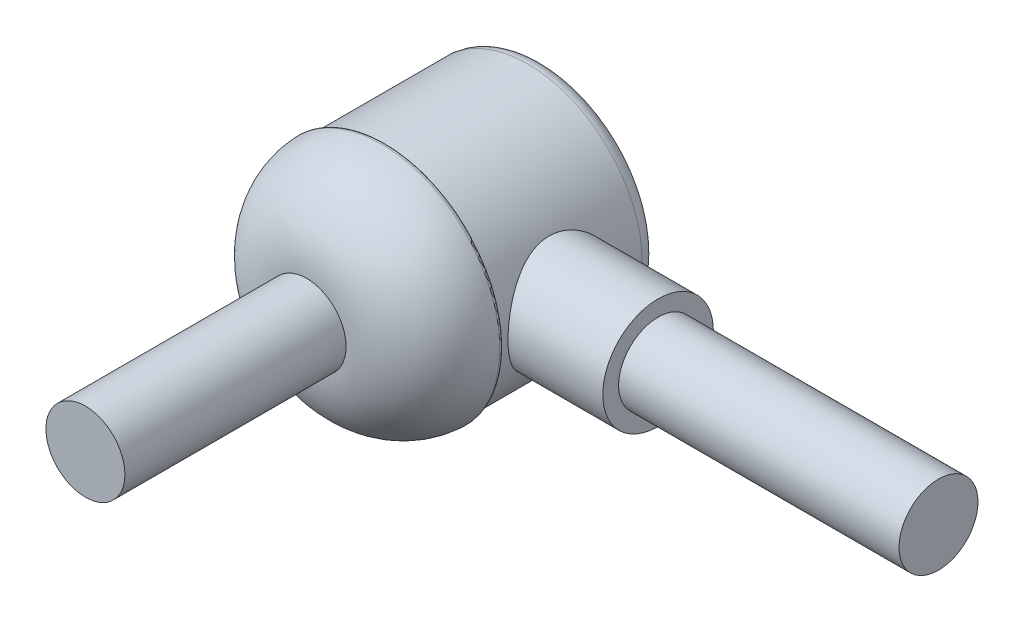
ISO-10303-21;
HEADER;
FILE_DESCRIPTION(('STEP AP214'),'2;1');
FILE_NAME('part.step','',(''),(''),'','','');
FILE_SCHEMA(('AUTOMOTIVE_DESIGN { 1 0 10303 214 1 1 1 1 }'));
ENDSEC;
DATA;
#1=APPLICATION_CONTEXT('core data for automotive mechanical design processes');
#2=APPLICATION_PROTOCOL_DEFINITION('international standard','automotive_design',2000,#1);
#3=PRODUCT_CONTEXT('',#1,'mechanical');
#4=PRODUCT('Part','Part','',(#3));
#5=PRODUCT_RELATED_PRODUCT_CATEGORY('part','',(#4));
#6=PRODUCT_DEFINITION_FORMATION('','',#4);
#7=PRODUCT_DEFINITION_CONTEXT('part definition',#1,'design');
#8=PRODUCT_DEFINITION('design','',#6,#7);
#9=PRODUCT_DEFINITION_SHAPE('','',#8);
#10=(LENGTH_UNIT() NAMED_UNIT(*) SI_UNIT(.MILLI.,.METRE.));
#11=(NAMED_UNIT(*) PLANE_ANGLE_UNIT() SI_UNIT($,.RADIAN.));
#12=(NAMED_UNIT(*) SI_UNIT($,.STERADIAN.) SOLID_ANGLE_UNIT());
#13=UNCERTAINTY_MEASURE_WITH_UNIT(LENGTH_MEASURE(1.E-05),#10,'distance_accuracy_value','');
#14=(GEOMETRIC_REPRESENTATION_CONTEXT(3) GLOBAL_UNCERTAINTY_ASSIGNED_CONTEXT((#13)) GLOBAL_UNIT_ASSIGNED_CONTEXT((#10,
#11,#12)) REPRESENTATION_CONTEXT('',''));
#15=CARTESIAN_POINT('',(0.,0.,0.));
#16=DIRECTION('',(0.,0.,1.));
#17=DIRECTION('',(1.,0.,0.));
#18=AXIS2_PLACEMENT_3D('',#15,#16,#17);
#19=CARTESIAN_POINT('',(0.,0.,20.));
#20=DIRECTION('',(0.,0.,-1.));
#21=DIRECTION('',(-1.,0.,0.));
#22=AXIS2_PLACEMENT_3D('',#19,#20,#21);
#23=CYLINDRICAL_SURFACE('',#22,14.5);
#24=CARTESIAN_POINT('',(14.5,0.,5.));
#25=CARTESIAN_POINT('',(14.4999990894041,0.184839274677734,5.00000103101229));
#26=CARTESIAN_POINT('',(14.4964569966747,0.369702617298462,5.00733002673489));
#27=CARTESIAN_POINT('',(14.4823770537962,0.738077638633396,5.03656654426171));
#28=CARTESIAN_POINT('',(14.4718358504673,0.921588626824022,5.05848105380162));
#29=CARTESIAN_POINT('',(14.4440098704436,1.28609486722004,5.1166813817496));
#30=CARTESIAN_POINT('',(14.4267144750627,1.46708569098696,5.1529898311357));
#31=CARTESIAN_POINT('',(14.3858167178365,1.82503312043389,5.23958742462796));
#32=CARTESIAN_POINT('',(14.362211775567,2.0019880433379,5.28988228911864));
#33=CARTESIAN_POINT('',(14.3093988088957,2.34987903046711,5.40368116437571));
#34=CARTESIAN_POINT('',(14.2802150170239,2.5208374731997,5.46712814411015));
#35=CARTESIAN_POINT('',(14.2168644680196,2.85656532312602,5.60679204894591));
#36=CARTESIAN_POINT('',(14.1826958142469,3.02133234446589,5.68301383625551));
#37=CARTESIAN_POINT('',(14.1101854815912,3.34363961231893,5.8475382205456));
#38=CARTESIAN_POINT('',(14.0718462133457,3.5011839595029,5.9358338462896));
#39=CARTESIAN_POINT('',(13.9918301431389,3.80840353866368,6.12390105488558));
#40=CARTESIAN_POINT('',(13.9501521229463,3.95807586502569,6.22367683241941));
#41=CARTESIAN_POINT('',(13.8165462491446,4.41083654456971,6.55130060629302));
#42=CARTESIAN_POINT('',(13.7203226173908,4.69925546320937,6.79808754680954));
#43=CARTESIAN_POINT('',(13.525995833904,5.23241766841134,7.33470064007824));
#44=CARTESIAN_POINT('',(13.4278914072174,5.47713007798995,7.62455695694695));
#45=CARTESIAN_POINT('',(13.2834263191544,5.81524643990373,8.09818134785609));
#46=CARTESIAN_POINT('',(13.2341731703362,5.92618130632474,8.26878965446267));
#47=CARTESIAN_POINT('',(13.1395308289295,6.13316102119215,8.61979257846233));
#48=CARTESIAN_POINT('',(13.0941400269875,6.2292120852205,8.80018306802901));
#49=CARTESIAN_POINT('',(13.0087828055759,6.40555817838801,9.16967759807622));
#50=CARTESIAN_POINT('',(12.9688148520949,6.4858576661985,9.35877915401636));
#51=CARTESIAN_POINT('',(12.8957925143856,6.62986136780075,9.74449599924679));
#52=CARTESIAN_POINT('',(12.862737417874,6.69356729151753,9.94111051194955));
#53=CARTESIAN_POINT('',(12.8065726113038,6.80037709478191,10.3287945645579));
#54=CARTESIAN_POINT('',(12.7829982014246,6.84445956430864,10.519526936771));
#55=CARTESIAN_POINT('',(12.7441222601613,6.91657676817495,10.9048412850294));
#56=CARTESIAN_POINT('',(12.7288203972039,6.94461214570332,11.0994231064602));
#57=CARTESIAN_POINT('',(12.7071387185377,6.98420632025818,11.4906066231633));
#58=CARTESIAN_POINT('',(12.7007522305666,6.99577743925297,11.6872066968483));
#59=CARTESIAN_POINT('',(12.6971579214465,7.00229956912249,12.080758674188));
#60=CARTESIAN_POINT('',(12.6999493257282,6.99725198253452,12.2777105467504));
#61=CARTESIAN_POINT('',(12.7137772902351,6.9720896665567,12.6485496744272));
#62=CARTESIAN_POINT('',(12.7238736197873,6.95369246286325,12.8225920914015));
#63=CARTESIAN_POINT('',(12.7508953077607,6.90401831854005,13.1683503740189));
#64=CARTESIAN_POINT('',(12.767822944077,6.87273708166559,13.3400654438495));
#65=CARTESIAN_POINT('',(12.8079561590967,6.79765147416613,13.6799472601185));
#66=CARTESIAN_POINT('',(12.8311607279085,6.7538491179918,13.8481145726655));
#67=CARTESIAN_POINT('',(12.8831484534022,6.65414489047538,14.179998717376));
#68=CARTESIAN_POINT('',(12.9119337924143,6.59823828483016,14.3437137798604));
#69=CARTESIAN_POINT('',(12.9749714509455,6.47341575115362,14.6694564857471));
#70=CARTESIAN_POINT('',(13.0093336340124,6.40423181941154,14.8313601529973));
#71=CARTESIAN_POINT('',(13.0820877856339,6.25427236956735,15.1487963427577));
#72=CARTESIAN_POINT('',(13.1204811999739,6.17349268885514,15.3043265514569));
#73=CARTESIAN_POINT('',(13.2402329058279,5.91459224367069,15.7602804421671));
#74=CARTESIAN_POINT('',(13.3261950133115,5.71984865396395,16.0502263698069));
#75=CARTESIAN_POINT('',(13.512834851897,5.26501207202325,16.6293178164888));
#76=CARTESIAN_POINT('',(13.6140568020916,4.99993622133478,16.914390799245));
#77=CARTESIAN_POINT('',(13.7621157090899,4.56917688004103,17.3066431674634));
#78=CARTESIAN_POINT('',(13.8108735550527,4.41994627433535,17.431578607184));
#79=CARTESIAN_POINT('',(13.9059248788977,4.11111957977815,17.6689130676049));
#80=CARTESIAN_POINT('',(13.9522192807892,3.95152742800571,17.7813168063751));
#81=CARTESIAN_POINT('',(14.0430014202778,3.61601295504801,17.9971549910963));
#82=CARTESIAN_POINT('',(14.087336324636,3.43968883286858,18.100029698108));
#83=CARTESIAN_POINT('',(14.1707960624341,3.07782250293468,18.290371667622));
#84=CARTESIAN_POINT('',(14.2099232194464,2.89228445729557,18.377845807151));
#85=CARTESIAN_POINT('',(14.2818338182271,2.51324798483039,18.5364957959288));
#86=CARTESIAN_POINT('',(14.3146194963371,2.31975239355459,18.6076773924219));
#87=CARTESIAN_POINT('',(14.3728628285277,1.92622898470977,18.7329238735702));
#88=CARTESIAN_POINT('',(14.3983212610997,1.72620186360678,18.7869905766776));
#89=CARTESIAN_POINT('',(14.4394175386021,1.33730550868415,18.8737264517628));
#90=CARTESIAN_POINT('',(14.4556720744507,1.14880229199555,18.9077480454082));
#91=CARTESIAN_POINT('',(14.4808347470467,0.769158335995945,18.9602520638446));
#92=CARTESIAN_POINT('',(14.4897432662069,0.578017734506497,18.9787352975198));
#93=CARTESIAN_POINT('',(14.4999593768177,0.194731045605584,18.9999219816066));
#94=CARTESIAN_POINT('',(14.5012697210913,0.0025853475975926,19.0026311469737));
#95=CARTESIAN_POINT('',(14.4962589687689,-0.381174678068444,18.9922489925334));
#96=CARTESIAN_POINT('',(14.4899381669388,-0.572789025964237,18.9791582830227));
#97=CARTESIAN_POINT('',(14.4705662180843,-0.940277211778181,18.9388450521189));
#98=CARTESIAN_POINT('',(14.4580281278441,-1.11629764266914,18.9126988795323));
#99=CARTESIAN_POINT('',(14.4268289931553,-1.46537412235373,18.8472055860035));
#100=CARTESIAN_POINT('',(14.4081658578465,-1.63842913761026,18.8078539571116));
#101=CARTESIAN_POINT('',(14.3651643075406,-1.98033739317533,18.716366123931));
#102=CARTESIAN_POINT('',(14.3408276852988,-2.14919194216759,18.6642339578744));
#103=CARTESIAN_POINT('',(14.2870221894116,-2.48181351683608,18.5476466216419));
#104=CARTESIAN_POINT('',(14.2575513204942,-2.64557853535375,18.4831866596796));
#105=CARTESIAN_POINT('',(14.1931952360881,-2.97180903148217,18.3404237227847));
#106=CARTESIAN_POINT('',(14.1581761665229,-3.13409431765206,18.2617690819276));
#107=CARTESIAN_POINT('',(14.0841790175451,-3.45144846080802,18.0926077267952));
#108=CARTESIAN_POINT('',(14.0451995946301,-3.60651484267847,18.0020969874475));
#109=CARTESIAN_POINT('',(13.9235868123044,-4.05972421945793,17.7137353494494));
#110=CARTESIAN_POINT('',(13.8362442309435,-4.3460465020937,17.4989804899233));
#111=CARTESIAN_POINT('',(13.6480442438974,-4.90676891665485,17.0075177358589));
#112=CARTESIAN_POINT('',(13.5466851536479,-5.17758943463685,16.7269074993203));
#113=CARTESIAN_POINT('',(13.3979065961606,-5.54651148400823,16.2748286472988));
#114=CARTESIAN_POINT('',(13.3488251164257,-5.66333349830697,16.1188261250045));
#115=CARTESIAN_POINT('',(13.2530738129673,-5.88391610258181,15.7970456935007));
#116=CARTESIAN_POINT('',(13.2064043282141,-5.98767485963594,15.6312664172839));
#117=CARTESIAN_POINT('',(13.1150813586926,-6.18522170264195,15.2839813467541));
#118=CARTESIAN_POINT('',(13.0705839313263,-6.27844257707209,15.1021114218602));
#119=CARTESIAN_POINT('',(12.9872824476867,-6.44899234826716,14.7299036879097));
#120=CARTESIAN_POINT('',(12.9484756647424,-6.5263288631834,14.5395699916191));
#121=CARTESIAN_POINT('',(12.8780377915676,-6.66424362933436,14.1517834748568));
#122=CARTESIAN_POINT('',(12.8464014292424,-6.72483420036338,13.9543360094362));
#123=CARTESIAN_POINT('',(12.791591736876,-6.82851617590599,13.5537537247528));
#124=CARTESIAN_POINT('',(12.7684172078497,-6.87161005967952,13.35061971563));
#125=CARTESIAN_POINT('',(12.7332880266179,-6.93646889176436,12.9596466765022));
#126=CARTESIAN_POINT('',(12.7204877758946,-6.95984969606705,12.7721505767712));
#127=CARTESIAN_POINT('',(12.7031903891986,-6.99137206270797,12.3955015283613));
#128=CARTESIAN_POINT('',(12.6986927092867,-6.99951462337345,12.2063486890389));
#129=CARTESIAN_POINT('',(12.6981807879992,-7.00044311097601,11.8280524409079));
#130=CARTESIAN_POINT('',(12.7021640339646,-6.99323358630282,11.6389090459044));
#131=CARTESIAN_POINT('',(12.7184493587624,-6.96357173408802,11.2621891163968));
#132=CARTESIAN_POINT('',(12.7307511772094,-6.94111988365692,11.074612533035));
#133=CARTESIAN_POINT('',(12.7618323381132,-6.88379226645708,10.7181153900508));
#134=CARTESIAN_POINT('',(12.7799845303699,-6.85011139502792,10.5489456346392));
#135=CARTESIAN_POINT('',(12.8223039495076,-6.77056496850691,10.2142078439957));
#136=CARTESIAN_POINT('',(12.8464731938892,-6.7246953262063,10.048641037111));
#137=CARTESIAN_POINT('',(12.9001063244359,-6.62122701445044,9.722132452348));
#138=CARTESIAN_POINT('',(12.9295694500822,-6.56363002958692,9.56119001398008));
#139=CARTESIAN_POINT('',(12.9929942180659,-6.4371658257192,9.24464911677518));
#140=CARTESIAN_POINT('',(13.0269575970809,-6.36829425334862,9.08905275036317));
#141=CARTESIAN_POINT('',(13.1008978315002,-6.21483733558527,8.77377139178281));
#142=CARTESIAN_POINT('',(13.1411247035309,-6.1295102083567,8.61450611156039));
#143=CARTESIAN_POINT('',(13.2246386771408,-5.94718310376805,8.30358181249841));
#144=CARTESIAN_POINT('',(13.2679268199112,-5.8501791469629,8.151925411842));
#145=CARTESIAN_POINT('',(13.356484763386,-5.64506803796915,7.8568736671475));
#146=CARTESIAN_POINT('',(13.4017550503807,-5.53695815224515,7.71348037055376));
#147=CARTESIAN_POINT('',(13.4932086328241,-5.3102040794302,7.43558343488318));
#148=CARTESIAN_POINT('',(13.539391988104,-5.19155920021566,7.30108038088788));
#149=CARTESIAN_POINT('',(13.6367428913356,-4.93059001148078,7.02718308091759));
#150=CARTESIAN_POINT('',(13.6878966680955,-4.78709810871825,6.88889359355144));
#151=CARTESIAN_POINT('',(13.788667135283,-4.48859278535821,6.62485071432427));
#152=CARTESIAN_POINT('',(13.8382842875906,-4.33358287542299,6.49909352978388));
#153=CARTESIAN_POINT('',(13.9347301021085,-4.01265410452606,6.26078510507448));
#154=CARTESIAN_POINT('',(13.9815560676674,-3.84672500962434,6.14824653713715));
#155=CARTESIAN_POINT('',(14.0710895023185,-3.50508269575046,5.93743755824838));
#156=CARTESIAN_POINT('',(14.1137988612359,-3.32937402532657,5.83916058959707));
#157=CARTESIAN_POINT('',(14.193973694948,-2.96903949836755,5.65764033583157));
#158=CARTESIAN_POINT('',(14.2314355728569,-2.78440764090572,5.57440735137936));
#159=CARTESIAN_POINT('',(14.2999902890249,-2.40767655599565,5.42396729987211));
#160=CARTESIAN_POINT('',(14.3310862410836,-2.21558103426173,5.35675239515503));
#161=CARTESIAN_POINT('',(14.3859415131589,-1.82574512884809,5.23923018289103));
#162=CARTESIAN_POINT('',(14.4097173601652,-1.62801857880972,5.18888476514774));
#163=CARTESIAN_POINT('',(14.4492799797953,-1.22825041855203,5.10557885507582));
#164=CARTESIAN_POINT('',(14.4650718485154,-1.02621164684314,5.07260727262646));
#165=CARTESIAN_POINT('',(14.4843833571529,-0.686535654022701,5.03239295648457));
#166=CARTESIAN_POINT('',(14.4902314712269,-0.549587905178049,5.02025379711934));
#167=CARTESIAN_POINT('',(14.4980401802305,-0.275097890535837,5.00405683389765));
#168=CARTESIAN_POINT('',(14.5000006776567,-0.137555609913835,4.99999923273058));
#169=CARTESIAN_POINT('',(14.5,0.,5.));
#170=B_SPLINE_CURVE_WITH_KNOTS('',3,(#24,#25,#26,#27,#28,#29,#30,#31,#32,#33,#34,#35,#36,#37,
#38,#39,#40,#41,#42,#43,#44,#45,#46,#47,#48,#49,#50,#51,#52,#53,#54,#55,#56,#57,#58,#59,#60,#61,
#62,#63,#64,#65,#66,#67,#68,#69,#70,#71,#72,#73,#74,#75,#76,#77,#78,#79,#80,#81,#82,#83,#84,#85,
#86,#87,#88,#89,#90,#91,#92,#93,#94,#95,#96,#97,#98,#99,#100,#101,#102,#103,#104,#105,#106,#107,
#108,#109,#110,#111,#112,#113,#114,#115,#116,#117,#118,#119,#120,#121,#122,#123,#124,#125,#126,
#127,#128,#129,#130,#131,#132,#133,#134,#135,#136,#137,#138,#139,#140,#141,#142,#143,#144,#145,
#146,#147,#148,#149,#150,#151,#152,#153,#154,#155,#156,#157,#158,#159,#160,#161,#162,#163,#164,
#165,#166,#167,#168,#169),.UNSPECIFIED.,.T.,.F.,(4,2,2,2,2,2,2,2,2,2,2,2,2,2,2,2,2,2,2,2,2,2,2,
2,2,2,2,2,2,2,2,2,2,2,2,2,2,2,2,2,2,2,2,2,2,2,2,2,2,2,2,2,2,2,2,2,2,2,2,2,2,2,2,2,2,2,2,2,2,2,2,
2,4),(0.,0.554381559123693,1.10902890682596,1.6645517836141,2.22030220191572,2.77369134485655,
3.32729159306852,3.88057354069649,4.43405829542537,5.60360863519607,6.77398197741057,
7.40144720466104,8.02864968765246,8.65567437650385,9.28263442645321,9.87332666645961,
10.4639952290765,11.0542214982,11.644397956396,12.1696891441317,12.6951556348092,
13.2205376337483,13.746125496387,14.2837195623688,14.8215070972489,15.8965671746248,
17.0975629539285,17.6989309590673,18.3000717846237,18.9259600049725,19.551568026055,
20.1769550207073,20.8022755458633,21.3782226447772,21.9541397596165,22.5298482063131,
23.1055344160159,23.6400949895021,24.1748382320058,24.7094127303939,25.2441954405571,
25.7947219380638,26.3454358226764,27.446305759023,28.6494628661829,29.2518538458568,
29.8543292537877,30.4809817902546,31.1073330782541,31.7332223328811,32.3590228687614,
32.9263893973175,33.4937187537879,34.0608800499628,34.6280235938512,35.1477770464692,
35.6677050062229,36.1875583327678,36.70761286163,37.2623610226547,37.8172987790917,
38.3723734527699,38.927484620531,39.5440007880148,40.1603298075634,40.7772449396751,
41.3938754998555,42.0109266825259,42.6276753186757,43.2430211008793,43.8579736163604,
44.2705286921168,44.6830941148236),.UNSPECIFIED.);
#171=CARTESIAN_POINT('',(14.5,0.,5.));
#172=VERTEX_POINT('',#171);
#173=EDGE_CURVE('E50',#172,#172,#170,.T.);
#174=ORIENTED_EDGE('',*,*,#173,.F.);
#175=EDGE_LOOP('',(#174));
#176=FACE_BOUND('',#175,.T.);
#177=CARTESIAN_POINT('',(0.,0.,2.));
#178=DIRECTION('',(0.,0.,1.));
#179=DIRECTION('',(1.,0.,0.));
#180=AXIS2_PLACEMENT_3D('',#177,#178,#179);
#181=CIRCLE('',#180,14.5);
#182=CARTESIAN_POINT('',(14.5,0.,2.));
#183=VERTEX_POINT('',#182);
#184=EDGE_CURVE('E43',#183,#183,#181,.T.);
#185=ORIENTED_EDGE('',*,*,#184,.T.);
#186=EDGE_LOOP('',(#185));
#187=FACE_BOUND('',#186,.T.);
#188=CARTESIAN_POINT('',(0.,0.,20.));
#189=DIRECTION('',(0.,0.,1.));
#190=DIRECTION('',(1.,0.,0.));
#191=AXIS2_PLACEMENT_3D('',#188,#189,#190);
#192=CIRCLE('',#191,14.5);
#193=CARTESIAN_POINT('',(14.5,0.,20.));
#194=VERTEX_POINT('',#193);
#195=EDGE_CURVE('E94',#194,#194,#192,.T.);
#196=ORIENTED_EDGE('',*,*,#195,.F.);
#197=EDGE_LOOP('',(#196));
#198=FACE_BOUND('',#197,.T.);
#199=ADVANCED_FACE('F31',(#176,#187,#198),#23,.T.);
#200=CARTESIAN_POINT('',(0.,0.,0.));
#201=DIRECTION('',(0.,0.,1.));
#202=DIRECTION('',(1.,0.,0.));
#203=AXIS2_PLACEMENT_3D('',#200,#201,#202);
#204=PLANE('',#203);
#205=CARTESIAN_POINT('',(0.,0.,0.));
#206=DIRECTION('',(0.,0.,1.));
#207=DIRECTION('',(1.,0.,0.));
#208=AXIS2_PLACEMENT_3D('',#205,#206,#207);
#209=CIRCLE('',#208,12.5);
#210=CARTESIAN_POINT('',(12.5,0.,0.));
#211=VERTEX_POINT('',#210);
#212=EDGE_CURVE('E35',#211,#211,#209,.F.);
#213=ORIENTED_EDGE('',*,*,#212,.T.);
#214=EDGE_LOOP('',(#213));
#215=FACE_BOUND('',#214,.T.);
#216=ADVANCED_FACE('F75',(#215),#204,.F.);
#217=CARTESIAN_POINT('',(0.,0.,20.));
#218=DIRECTION('',(0.,0.,1.));
#219=DIRECTION('',(1.,0.,0.));
#220=AXIS2_PLACEMENT_3D('',#217,#218,#219);
#221=DEGENERATE_TOROIDAL_SURFACE('',#220,5.,10.,.T.);
#222=CARTESIAN_POINT('',(0.,0.,20.5261335156017));
#223=DIRECTION('',(0.,0.,-1.));
#224=DIRECTION('',(-1.,0.,0.));
#225=AXIS2_PLACEMENT_3D('',#222,#223,#224);
#226=CIRCLE('',#225,14.9861495844875);
#227=CARTESIAN_POINT('',(-14.9861495844875,0.,20.5261335156017));
#228=VERTEX_POINT('',#227);
#229=EDGE_CURVE('E97',#228,#228,#226,.F.);
#230=ORIENTED_EDGE('',*,*,#229,.T.);
#231=EDGE_LOOP('',(#230));
#232=FACE_BOUND('',#231,.T.);
#233=CARTESIAN_POINT('',(0.,0.,30.));
#234=DIRECTION('',(0.,0.,1.));
#235=DIRECTION('',(1.,0.,0.));
#236=AXIS2_PLACEMENT_3D('',#233,#234,#235);
#237=CIRCLE('',#236,5.);
#238=CARTESIAN_POINT('',(5.,0.,30.));
#239=VERTEX_POINT('',#238);
#240=EDGE_CURVE('E98',#239,#239,#237,.T.);
#241=ORIENTED_EDGE('',*,*,#240,.F.);
#242=EDGE_LOOP('',(#241));
#243=FACE_BOUND('',#242,.T.);
#244=ADVANCED_FACE('F73',(#232,#243),#221,.T.);
#245=CARTESIAN_POINT('',(0.,0.,58.));
#246=DIRECTION('',(0.,0.,-1.));
#247=DIRECTION('',(-1.,0.,0.));
#248=AXIS2_PLACEMENT_3D('',#245,#246,#247);
#249=CYLINDRICAL_SURFACE('',#248,5.);
#250=CARTESIAN_POINT('',(0.,0.,58.));
#251=DIRECTION('',(0.,0.,1.));
#252=DIRECTION('',(1.,0.,0.));
#253=AXIS2_PLACEMENT_3D('',#250,#251,#252);
#254=CIRCLE('',#253,5.);
#255=CARTESIAN_POINT('',(5.,0.,58.));
#256=VERTEX_POINT('',#255);
#257=EDGE_CURVE('E58',#256,#256,#254,.T.);
#258=ORIENTED_EDGE('',*,*,#257,.F.);
#259=EDGE_LOOP('',(#258));
#260=FACE_BOUND('',#259,.T.);
#261=ORIENTED_EDGE('',*,*,#240,.T.);
#262=EDGE_LOOP('',(#261));
#263=FACE_BOUND('',#262,.T.);
#264=ADVANCED_FACE('F69',(#260,#263),#249,.T.);
#265=CARTESIAN_POINT('',(0.,0.,58.));
#266=DIRECTION('',(0.,0.,1.));
#267=DIRECTION('',(1.,0.,0.));
#268=AXIS2_PLACEMENT_3D('',#265,#266,#267);
#269=PLANE('',#268);
#270=ORIENTED_EDGE('',*,*,#257,.T.);
#271=EDGE_LOOP('',(#270));
#272=FACE_BOUND('',#271,.T.);
#273=ADVANCED_FACE('F65',(#272),#269,.T.);
#274=CARTESIAN_POINT('',(0.,0.,20.4998268398216));
#275=DIRECTION('',(0.,0.,-1.));
#276=DIRECTION('',(-1.,0.,0.));
#277=AXIS2_PLACEMENT_3D('',#274,#275,#276);
#278=TOROIDAL_SURFACE('',#277,14.4868421052632,0.5);
#279=ORIENTED_EDGE('',*,*,#195,.T.);
#280=EDGE_LOOP('',(#279));
#281=FACE_BOUND('',#280,.T.);
#282=ORIENTED_EDGE('',*,*,#229,.F.);
#283=EDGE_LOOP('',(#282));
#284=FACE_BOUND('',#283,.T.);
#285=ADVANCED_FACE('F68',(#281,#284),#278,.T.);
#286=CARTESIAN_POINT('',(0.,0.,2.));
#287=DIRECTION('',(0.,0.,1.));
#288=DIRECTION('',(1.,0.,0.));
#289=AXIS2_PLACEMENT_3D('',#286,#287,#288);
#290=TOROIDAL_SURFACE('',#289,12.5,2.);
#291=ORIENTED_EDGE('',*,*,#212,.F.);
#292=EDGE_LOOP('',(#291));
#293=FACE_BOUND('',#292,.T.);
#294=ORIENTED_EDGE('',*,*,#184,.F.);
#295=EDGE_LOOP('',(#294));
#296=FACE_BOUND('',#295,.T.);
#297=ADVANCED_FACE('F33',(#293,#296),#290,.T.);
#298=CARTESIAN_POINT('',(26.5,0.,12.));
#299=DIRECTION('',(1.,0.,0.));
#300=DIRECTION('',(0.,0.,-1.));
#301=AXIS2_PLACEMENT_3D('',#298,#299,#300);
#302=PLANE('',#301);
#303=CARTESIAN_POINT('',(26.5,0.,12.));
#304=DIRECTION('',(1.,0.,0.));
#305=DIRECTION('',(0.,0.,-1.));
#306=AXIS2_PLACEMENT_3D('',#303,#304,#305);
#307=CIRCLE('',#306,5.);
#308=CARTESIAN_POINT('',(26.5,0.,7.));
#309=VERTEX_POINT('',#308);
#310=EDGE_CURVE('E10',#309,#309,#307,.T.);
#311=ORIENTED_EDGE('',*,*,#310,.F.);
#312=EDGE_LOOP('',(#311));
#313=FACE_BOUND('',#312,.T.);
#314=CARTESIAN_POINT('',(26.5,0.,12.));
#315=DIRECTION('',(1.,0.,0.));
#316=DIRECTION('',(0.,0.,-1.));
#317=AXIS2_PLACEMENT_3D('',#314,#315,#316);
#318=CIRCLE('',#317,7.);
#319=CARTESIAN_POINT('',(26.5,0.,5.));
#320=VERTEX_POINT('',#319);
#321=EDGE_CURVE('E47',#320,#320,#318,.T.);
#322=ORIENTED_EDGE('',*,*,#321,.T.);
#323=EDGE_LOOP('',(#322));
#324=FACE_BOUND('',#323,.T.);
#325=ADVANCED_FACE('F89',(#313,#324),#302,.T.);
#326=CARTESIAN_POINT('',(-14.9888421052632,0.,12.));
#327=DIRECTION('',(1.,0.,0.));
#328=DIRECTION('',(0.,0.,-1.));
#329=AXIS2_PLACEMENT_3D('',#326,#327,#328);
#330=CYLINDRICAL_SURFACE('',#329,7.);
#331=ORIENTED_EDGE('',*,*,#321,.F.);
#332=EDGE_LOOP('',(#331));
#333=FACE_BOUND('',#332,.T.);
#334=ORIENTED_EDGE('',*,*,#173,.T.);
#335=EDGE_LOOP('',(#334));
#336=FACE_BOUND('',#335,.T.);
#337=ADVANCED_FACE('F60',(#333,#336),#330,.T.);
#338=CARTESIAN_POINT('',(62.,0.,12.));
#339=DIRECTION('',(-1.,0.,0.));
#340=DIRECTION('',(0.,0.,1.));
#341=AXIS2_PLACEMENT_3D('',#338,#339,#340);
#342=CYLINDRICAL_SURFACE('',#341,5.);
#343=CARTESIAN_POINT('',(62.,0.,12.));
#344=DIRECTION('',(1.,0.,0.));
#345=DIRECTION('',(0.,0.,-1.));
#346=AXIS2_PLACEMENT_3D('',#343,#344,#345);
#347=CIRCLE('',#346,5.);
#348=CARTESIAN_POINT('',(62.,0.,7.));
#349=VERTEX_POINT('',#348);
#350=EDGE_CURVE('E46',#349,#349,#347,.T.);
#351=ORIENTED_EDGE('',*,*,#350,.F.);
#352=EDGE_LOOP('',(#351));
#353=FACE_BOUND('',#352,.T.);
#354=ORIENTED_EDGE('',*,*,#310,.T.);
#355=EDGE_LOOP('',(#354));
#356=FACE_BOUND('',#355,.T.);
#357=ADVANCED_FACE('F116',(#353,#356),#342,.T.);
#358=CARTESIAN_POINT('',(62.,0.,12.));
#359=DIRECTION('',(1.,0.,0.));
#360=DIRECTION('',(0.,0.,-1.));
#361=AXIS2_PLACEMENT_3D('',#358,#359,#360);
#362=PLANE('',#361);
#363=ORIENTED_EDGE('',*,*,#350,.T.);
#364=EDGE_LOOP('',(#363));
#365=FACE_BOUND('',#364,.T.);
#366=ADVANCED_FACE('F123',(#365),#362,.T.);
#367=CLOSED_SHELL('',(#199,#216,#244,#264,#273,#285,#297,#325,#337,#357,#366));
#368=MANIFOLD_SOLID_BREP('B2',#367);
#369=ADVANCED_BREP_SHAPE_REPRESENTATION('',(#18,#368),#14);
#370=SHAPE_DEFINITION_REPRESENTATION(#9,#369);
ENDSEC;
END-ISO-10303-21;
